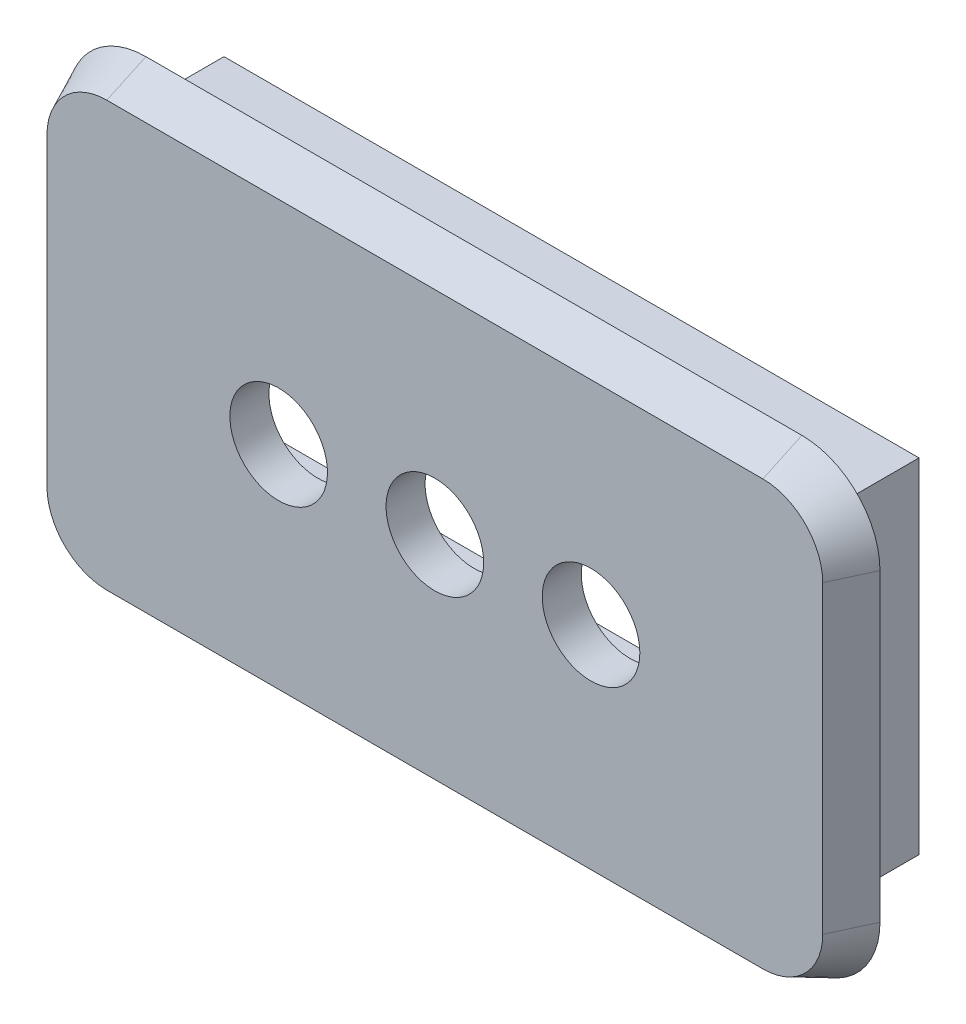
ISO-10303-21;
HEADER;
FILE_DESCRIPTION(('STEP AP214'),'2;1');
FILE_NAME('part.step','',(''),(''),'','','');
FILE_SCHEMA(('AUTOMOTIVE_DESIGN { 1 0 10303 214 1 1 1 1 }'));
ENDSEC;
DATA;
#1=APPLICATION_CONTEXT('core data for automotive mechanical design processes');
#2=APPLICATION_PROTOCOL_DEFINITION('international standard','automotive_design',2000,#1);
#3=PRODUCT_CONTEXT('',#1,'mechanical');
#4=PRODUCT('Part','Part','',(#3));
#5=PRODUCT_RELATED_PRODUCT_CATEGORY('part','',(#4));
#6=PRODUCT_DEFINITION_FORMATION('','',#4);
#7=PRODUCT_DEFINITION_CONTEXT('part definition',#1,'design');
#8=PRODUCT_DEFINITION('design','',#6,#7);
#9=PRODUCT_DEFINITION_SHAPE('','',#8);
#10=(LENGTH_UNIT() NAMED_UNIT(*) SI_UNIT(.MILLI.,.METRE.));
#11=(NAMED_UNIT(*) PLANE_ANGLE_UNIT() SI_UNIT($,.RADIAN.));
#12=(NAMED_UNIT(*) SI_UNIT($,.STERADIAN.) SOLID_ANGLE_UNIT());
#13=UNCERTAINTY_MEASURE_WITH_UNIT(LENGTH_MEASURE(1.E-05),#10,'distance_accuracy_value','');
#14=(GEOMETRIC_REPRESENTATION_CONTEXT(3) GLOBAL_UNCERTAINTY_ASSIGNED_CONTEXT((#13)) GLOBAL_UNIT_ASSIGNED_CONTEXT((#10,
#11,#12)) REPRESENTATION_CONTEXT('',''));
#15=CARTESIAN_POINT('',(0.,0.,0.));
#16=DIRECTION('',(0.,0.,1.));
#17=DIRECTION('',(1.,0.,0.));
#18=AXIS2_PLACEMENT_3D('',#15,#16,#17);
#19=CARTESIAN_POINT('',(9.33499999999989,29.9,-2.5));
#20=DIRECTION('',(0.,1.,0.));
#21=DIRECTION('',(0.,0.,1.));
#22=AXIS2_PLACEMENT_3D('',#19,#20,#21);
#23=PLANE('',#22);
#24=DIRECTION('',(-1.,0.,0.));
#25=VECTOR('',#24,1.);
#26=CARTESIAN_POINT('',(9.33499999999989,29.9,0.));
#27=LINE('',#26,#25);
#28=CARTESIAN_POINT('',(9.33499999999989,29.9,0.));
#29=VERTEX_POINT('',#28);
#30=CARTESIAN_POINT('',(-8.46500000000011,29.9,0.));
#31=VERTEX_POINT('',#30);
#32=EDGE_CURVE('E265',#29,#31,#27,.T.);
#33=ORIENTED_EDGE('',*,*,#32,.F.);
#34=DIRECTION('',(0.,0.,1.));
#35=VECTOR('',#34,1.);
#36=CARTESIAN_POINT('',(9.33499999999989,29.9,-2.5));
#37=LINE('',#36,#35);
#38=CARTESIAN_POINT('',(9.33499999999989,29.9,-2.5));
#39=VERTEX_POINT('',#38);
#40=EDGE_CURVE('E11',#39,#29,#37,.T.);
#41=ORIENTED_EDGE('',*,*,#40,.F.);
#42=DIRECTION('',(-1.,0.,0.));
#43=VECTOR('',#42,1.);
#44=CARTESIAN_POINT('',(9.33499999999989,29.9,-2.5));
#45=LINE('',#44,#43);
#46=CARTESIAN_POINT('',(-8.46500000000011,29.9,-2.5));
#47=VERTEX_POINT('',#46);
#48=EDGE_CURVE('E273',#39,#47,#45,.T.);
#49=ORIENTED_EDGE('',*,*,#48,.T.);
#50=DIRECTION('',(0.,0.,1.));
#51=VECTOR('',#50,1.);
#52=CARTESIAN_POINT('',(-8.46500000000011,29.9,-2.5));
#53=LINE('',#52,#51);
#54=EDGE_CURVE('E44',#47,#31,#53,.T.);
#55=ORIENTED_EDGE('',*,*,#54,.T.);
#56=EDGE_LOOP('',(#33,#41,#49,#55));
#57=FACE_BOUND('',#56,.T.);
#58=ADVANCED_FACE('F41',(#57),#23,.T.);
#59=CARTESIAN_POINT('',(9.33499999999988,21.1,-2.5));
#60=DIRECTION('',(1.,0.,0.));
#61=DIRECTION('',(0.,1.,0.));
#62=AXIS2_PLACEMENT_3D('',#59,#60,#61);
#63=PLANE('',#62);
#64=DIRECTION('',(0.,1.,0.));
#65=VECTOR('',#64,1.);
#66=CARTESIAN_POINT('',(9.33499999999988,21.1,0.));
#67=LINE('',#66,#65);
#68=CARTESIAN_POINT('',(9.33499999999988,21.1,0.));
#69=VERTEX_POINT('',#68);
#70=EDGE_CURVE('E276',#69,#29,#67,.T.);
#71=ORIENTED_EDGE('',*,*,#70,.F.);
#72=DIRECTION('',(0.,0.,1.));
#73=VECTOR('',#72,1.);
#74=CARTESIAN_POINT('',(9.33499999999988,21.1,-2.5));
#75=LINE('',#74,#73);
#76=CARTESIAN_POINT('',(9.33499999999988,21.1,-2.5));
#77=VERTEX_POINT('',#76);
#78=EDGE_CURVE('E49',#77,#69,#75,.T.);
#79=ORIENTED_EDGE('',*,*,#78,.F.);
#80=DIRECTION('',(0.,1.,0.));
#81=VECTOR('',#80,1.);
#82=CARTESIAN_POINT('',(9.33499999999988,21.1,-2.5));
#83=LINE('',#82,#81);
#84=EDGE_CURVE('E280',#77,#39,#83,.T.);
#85=ORIENTED_EDGE('',*,*,#84,.T.);
#86=ORIENTED_EDGE('',*,*,#40,.T.);
#87=EDGE_LOOP('',(#71,#79,#85,#86));
#88=FACE_BOUND('',#87,.T.);
#89=ADVANCED_FACE('F296',(#88),#63,.T.);
#90=CARTESIAN_POINT('',(-8.46500000000011,21.1,-2.5));
#91=DIRECTION('',(0.,-1.,0.));
#92=DIRECTION('',(0.,0.,-1.));
#93=AXIS2_PLACEMENT_3D('',#90,#91,#92);
#94=PLANE('',#93);
#95=DIRECTION('',(1.,0.,0.));
#96=VECTOR('',#95,1.);
#97=CARTESIAN_POINT('',(-8.46500000000011,21.1,0.));
#98=LINE('',#97,#96);
#99=CARTESIAN_POINT('',(-8.46500000000011,21.1,0.));
#100=VERTEX_POINT('',#99);
#101=EDGE_CURVE('E288',#100,#69,#98,.T.);
#102=ORIENTED_EDGE('',*,*,#101,.F.);
#103=DIRECTION('',(0.,0.,1.));
#104=VECTOR('',#103,1.);
#105=CARTESIAN_POINT('',(-8.46500000000011,21.1,-2.5));
#106=LINE('',#105,#104);
#107=CARTESIAN_POINT('',(-8.46500000000011,21.1,-2.5));
#108=VERTEX_POINT('',#107);
#109=EDGE_CURVE('E293',#108,#100,#106,.T.);
#110=ORIENTED_EDGE('',*,*,#109,.F.);
#111=DIRECTION('',(1.,0.,0.));
#112=VECTOR('',#111,1.);
#113=CARTESIAN_POINT('',(-8.46500000000011,21.1,-2.5));
#114=LINE('',#113,#112);
#115=EDGE_CURVE('E278',#108,#77,#114,.T.);
#116=ORIENTED_EDGE('',*,*,#115,.T.);
#117=ORIENTED_EDGE('',*,*,#78,.T.);
#118=EDGE_LOOP('',(#102,#110,#116,#117));
#119=FACE_BOUND('',#118,.T.);
#120=ADVANCED_FACE('F301',(#119),#94,.T.);
#121=CARTESIAN_POINT('',(-8.46500000000011,29.9,-2.5));
#122=DIRECTION('',(-1.,0.,0.));
#123=DIRECTION('',(0.,-1.,0.));
#124=AXIS2_PLACEMENT_3D('',#121,#122,#123);
#125=PLANE('',#124);
#126=DIRECTION('',(0.,-1.,0.));
#127=VECTOR('',#126,1.);
#128=CARTESIAN_POINT('',(-8.46500000000011,29.9,0.));
#129=LINE('',#128,#127);
#130=EDGE_CURVE('E285',#31,#100,#129,.T.);
#131=ORIENTED_EDGE('',*,*,#130,.F.);
#132=ORIENTED_EDGE('',*,*,#54,.F.);
#133=DIRECTION('',(0.,-1.,0.));
#134=VECTOR('',#133,1.);
#135=CARTESIAN_POINT('',(-8.46500000000011,29.9,-2.5));
#136=LINE('',#135,#134);
#137=EDGE_CURVE('E275',#47,#108,#136,.T.);
#138=ORIENTED_EDGE('',*,*,#137,.T.);
#139=ORIENTED_EDGE('',*,*,#109,.T.);
#140=EDGE_LOOP('',(#131,#132,#138,#139));
#141=FACE_BOUND('',#140,.T.);
#142=ADVANCED_FACE('F294',(#141),#125,.T.);
#143=CARTESIAN_POINT('',(0.,0.,-2.5));
#144=DIRECTION('',(0.,0.,1.));
#145=DIRECTION('',(1.,0.,0.));
#146=AXIS2_PLACEMENT_3D('',#143,#144,#145);
#147=PLANE('',#146);
#148=DIRECTION('',(0.,1.,0.));
#149=VECTOR('',#148,1.);
#150=CARTESIAN_POINT('',(8.33499999999988,22.1,-2.5));
#151=LINE('',#150,#149);
#152=CARTESIAN_POINT('',(8.33499999999988,22.1,-2.5));
#153=VERTEX_POINT('',#152);
#154=CARTESIAN_POINT('',(8.33499999999988,28.9,-2.5));
#155=VERTEX_POINT('',#154);
#156=EDGE_CURVE('E248',#153,#155,#151,.T.);
#157=ORIENTED_EDGE('',*,*,#156,.T.);
#158=DIRECTION('',(-1.,0.,0.));
#159=VECTOR('',#158,1.);
#160=CARTESIAN_POINT('',(8.33499999999988,28.9,-2.5));
#161=LINE('',#160,#159);
#162=CARTESIAN_POINT('',(-7.46500000000011,28.9,-2.5));
#163=VERTEX_POINT('',#162);
#164=EDGE_CURVE('E240',#155,#163,#161,.T.);
#165=ORIENTED_EDGE('',*,*,#164,.T.);
#166=DIRECTION('',(0.,-1.,0.));
#167=VECTOR('',#166,1.);
#168=CARTESIAN_POINT('',(-7.46500000000011,28.9,-2.5));
#169=LINE('',#168,#167);
#170=CARTESIAN_POINT('',(-7.46500000000011,22.1,-2.5));
#171=VERTEX_POINT('',#170);
#172=EDGE_CURVE('E243',#163,#171,#169,.T.);
#173=ORIENTED_EDGE('',*,*,#172,.T.);
#174=DIRECTION('',(1.,0.,0.));
#175=VECTOR('',#174,1.);
#176=CARTESIAN_POINT('',(-7.46500000000011,22.1,-2.5));
#177=LINE('',#176,#175);
#178=EDGE_CURVE('E57',#171,#153,#177,.T.);
#179=ORIENTED_EDGE('',*,*,#178,.T.);
#180=EDGE_LOOP('',(#157,#165,#173,#179));
#181=FACE_BOUND('',#180,.T.);
#182=ORIENTED_EDGE('',*,*,#48,.F.);
#183=ORIENTED_EDGE('',*,*,#84,.F.);
#184=ORIENTED_EDGE('',*,*,#115,.F.);
#185=ORIENTED_EDGE('',*,*,#137,.F.);
#186=EDGE_LOOP('',(#182,#183,#184,#185));
#187=FACE_BOUND('',#186,.T.);
#188=ADVANCED_FACE('F300',(#181,#187),#147,.F.);
#189=CARTESIAN_POINT('',(8.33499999999988,28.9,-2.5));
#190=DIRECTION('',(0.,1.,0.));
#191=DIRECTION('',(-1.,0.,0.));
#192=AXIS2_PLACEMENT_3D('',#189,#190,#191);
#193=PLANE('',#192);
#194=DIRECTION('',(-1.,0.,0.));
#195=VECTOR('',#194,1.);
#196=CARTESIAN_POINT('',(8.33499999999988,28.9,0.));
#197=LINE('',#196,#195);
#198=CARTESIAN_POINT('',(8.33499999999988,28.9,0.));
#199=VERTEX_POINT('',#198);
#200=CARTESIAN_POINT('',(-7.46500000000011,28.9,0.));
#201=VERTEX_POINT('',#200);
#202=EDGE_CURVE('E183',#199,#201,#197,.T.);
#203=ORIENTED_EDGE('',*,*,#202,.T.);
#204=DIRECTION('',(0.,0.,1.));
#205=VECTOR('',#204,1.);
#206=CARTESIAN_POINT('',(-7.46500000000011,28.9,-2.5));
#207=LINE('',#206,#205);
#208=EDGE_CURVE('E251',#163,#201,#207,.T.);
#209=ORIENTED_EDGE('',*,*,#208,.F.);
#210=ORIENTED_EDGE('',*,*,#164,.F.);
#211=DIRECTION('',(0.,0.,1.));
#212=VECTOR('',#211,1.);
#213=CARTESIAN_POINT('',(8.33499999999988,28.9,-2.5));
#214=LINE('',#213,#212);
#215=EDGE_CURVE('E262',#155,#199,#214,.T.);
#216=ORIENTED_EDGE('',*,*,#215,.T.);
#217=EDGE_LOOP('',(#203,#209,#210,#216));
#218=FACE_BOUND('',#217,.T.);
#219=ADVANCED_FACE('F339',(#218),#193,.F.);
#220=CARTESIAN_POINT('',(8.33499999999988,22.1,-2.5));
#221=DIRECTION('',(1.,0.,0.));
#222=DIRECTION('',(0.,1.,0.));
#223=AXIS2_PLACEMENT_3D('',#220,#221,#222);
#224=PLANE('',#223);
#225=DIRECTION('',(0.,1.,0.));
#226=VECTOR('',#225,1.);
#227=CARTESIAN_POINT('',(8.33499999999988,22.1,0.));
#228=LINE('',#227,#226);
#229=CARTESIAN_POINT('',(8.33499999999988,22.1,0.));
#230=VERTEX_POINT('',#229);
#231=EDGE_CURVE('E244',#230,#199,#228,.T.);
#232=ORIENTED_EDGE('',*,*,#231,.T.);
#233=ORIENTED_EDGE('',*,*,#215,.F.);
#234=ORIENTED_EDGE('',*,*,#156,.F.);
#235=DIRECTION('',(0.,0.,1.));
#236=VECTOR('',#235,1.);
#237=CARTESIAN_POINT('',(8.33499999999988,22.1,-2.5));
#238=LINE('',#237,#236);
#239=EDGE_CURVE('E266',#153,#230,#238,.T.);
#240=ORIENTED_EDGE('',*,*,#239,.T.);
#241=EDGE_LOOP('',(#232,#233,#234,#240));
#242=FACE_BOUND('',#241,.T.);
#243=ADVANCED_FACE('F347',(#242),#224,.F.);
#244=CARTESIAN_POINT('',(-7.46500000000011,22.1,-2.5));
#245=DIRECTION('',(0.,-1.,0.));
#246=DIRECTION('',(0.,0.,-1.));
#247=AXIS2_PLACEMENT_3D('',#244,#245,#246);
#248=PLANE('',#247);
#249=DIRECTION('',(1.,0.,0.));
#250=VECTOR('',#249,1.);
#251=CARTESIAN_POINT('',(-7.46500000000011,22.1,0.));
#252=LINE('',#251,#250);
#253=CARTESIAN_POINT('',(-7.46500000000011,22.1,0.));
#254=VERTEX_POINT('',#253);
#255=EDGE_CURVE('E257',#254,#230,#252,.T.);
#256=ORIENTED_EDGE('',*,*,#255,.T.);
#257=ORIENTED_EDGE('',*,*,#239,.F.);
#258=ORIENTED_EDGE('',*,*,#178,.F.);
#259=DIRECTION('',(0.,0.,1.));
#260=VECTOR('',#259,1.);
#261=CARTESIAN_POINT('',(-7.46500000000011,22.1,-2.5));
#262=LINE('',#261,#260);
#263=EDGE_CURVE('E269',#171,#254,#262,.T.);
#264=ORIENTED_EDGE('',*,*,#263,.T.);
#265=EDGE_LOOP('',(#256,#257,#258,#264));
#266=FACE_BOUND('',#265,.T.);
#267=ADVANCED_FACE('F357',(#266),#248,.F.);
#268=CARTESIAN_POINT('',(-7.46500000000011,28.9,-2.5));
#269=DIRECTION('',(-1.,0.,0.));
#270=DIRECTION('',(0.,0.,1.));
#271=AXIS2_PLACEMENT_3D('',#268,#269,#270);
#272=PLANE('',#271);
#273=DIRECTION('',(0.,-1.,0.));
#274=VECTOR('',#273,1.);
#275=CARTESIAN_POINT('',(-7.46500000000011,28.9,0.));
#276=LINE('',#275,#274);
#277=EDGE_CURVE('E254',#201,#254,#276,.T.);
#278=ORIENTED_EDGE('',*,*,#277,.T.);
#279=ORIENTED_EDGE('',*,*,#263,.F.);
#280=ORIENTED_EDGE('',*,*,#172,.F.);
#281=ORIENTED_EDGE('',*,*,#208,.T.);
#282=EDGE_LOOP('',(#278,#279,#280,#281));
#283=FACE_BOUND('',#282,.T.);
#284=ADVANCED_FACE('F367',(#283),#272,.F.);
#285=CARTESIAN_POINT('',(8.83499999999989,29.4,1.));
#286=DIRECTION('',(0.,0.,1.));
#287=DIRECTION('',(1.,0.,0.));
#288=AXIS2_PLACEMENT_3D('',#285,#286,#287);
#289=PLANE('',#288);
#290=CARTESIAN_POINT('',(4.43499999999989,25.5,1.));
#291=DIRECTION('',(0.,0.,1.));
#292=DIRECTION('',(1.,0.,0.));
#293=AXIS2_PLACEMENT_3D('',#290,#291,#292);
#294=CIRCLE('',#293,1.25);
#295=CARTESIAN_POINT('',(5.68499999999989,25.5,1.));
#296=VERTEX_POINT('',#295);
#297=EDGE_CURVE('E515',#296,#296,#294,.T.);
#298=ORIENTED_EDGE('',*,*,#297,.F.);
#299=EDGE_LOOP('',(#298));
#300=FACE_BOUND('',#299,.T.);
#301=CARTESIAN_POINT('',(-3.56500000000011,25.5,1.));
#302=DIRECTION('',(0.,0.,1.));
#303=DIRECTION('',(1.,0.,0.));
#304=AXIS2_PLACEMENT_3D('',#301,#302,#303);
#305=CIRCLE('',#304,1.25);
#306=CARTESIAN_POINT('',(-2.31500000000011,25.5,1.));
#307=VERTEX_POINT('',#306);
#308=EDGE_CURVE('E523',#307,#307,#305,.T.);
#309=ORIENTED_EDGE('',*,*,#308,.F.);
#310=EDGE_LOOP('',(#309));
#311=FACE_BOUND('',#310,.T.);
#312=CARTESIAN_POINT('',(0.434999999999888,25.5,1.));
#313=DIRECTION('',(0.,0.,1.));
#314=DIRECTION('',(1.,0.,0.));
#315=AXIS2_PLACEMENT_3D('',#312,#313,#314);
#316=CIRCLE('',#315,1.25);
#317=CARTESIAN_POINT('',(1.68499999999989,25.5,1.));
#318=VERTEX_POINT('',#317);
#319=EDGE_CURVE('E193',#318,#318,#316,.T.);
#320=ORIENTED_EDGE('',*,*,#319,.F.);
#321=EDGE_LOOP('',(#320));
#322=FACE_BOUND('',#321,.T.);
#323=CARTESIAN_POINT('',(8.83499999999989,29.4,1.));
#324=DIRECTION('',(0.,0.,1.));
#325=DIRECTION('',(1.,0.,0.));
#326=AXIS2_PLACEMENT_3D('',#323,#324,#325);
#327=CIRCLE('',#326,1.533692341845);
#328=CARTESIAN_POINT('',(10.3686923418449,29.4,1.));
#329=VERTEX_POINT('',#328);
#330=CARTESIAN_POINT('',(8.83499999999989,30.933692341845,1.));
#331=VERTEX_POINT('',#330);
#332=EDGE_CURVE('E207',#329,#331,#327,.T.);
#333=ORIENTED_EDGE('',*,*,#332,.T.);
#334=DIRECTION('',(1.,0.,0.));
#335=VECTOR('',#334,1.);
#336=CARTESIAN_POINT('',(8.83499999999989,30.933692341845,1.));
#337=LINE('',#336,#335);
#338=CARTESIAN_POINT('',(-7.96500000000011,30.933692341845,1.));
#339=VERTEX_POINT('',#338);
#340=EDGE_CURVE('E179',#331,#339,#337,.F.);
#341=ORIENTED_EDGE('',*,*,#340,.T.);
#342=CARTESIAN_POINT('',(-7.96500000000011,29.4,1.));
#343=DIRECTION('',(0.,0.,1.));
#344=DIRECTION('',(1.,0.,0.));
#345=AXIS2_PLACEMENT_3D('',#342,#343,#344);
#346=CIRCLE('',#345,1.533692341845);
#347=CARTESIAN_POINT('',(-9.49869234184511,29.4,1.));
#348=VERTEX_POINT('',#347);
#349=EDGE_CURVE('E229',#339,#348,#346,.T.);
#350=ORIENTED_EDGE('',*,*,#349,.T.);
#351=DIRECTION('',(0.,1.,0.));
#352=VECTOR('',#351,1.);
#353=CARTESIAN_POINT('',(-9.49869234184511,29.4,1.));
#354=LINE('',#353,#352);
#355=CARTESIAN_POINT('',(-9.49869234184511,21.6,1.));
#356=VERTEX_POINT('',#355);
#357=EDGE_CURVE('E231',#348,#356,#354,.F.);
#358=ORIENTED_EDGE('',*,*,#357,.T.);
#359=CARTESIAN_POINT('',(-7.96500000000011,21.6,1.));
#360=DIRECTION('',(0.,0.,1.));
#361=DIRECTION('',(1.,0.,0.));
#362=AXIS2_PLACEMENT_3D('',#359,#360,#361);
#363=CIRCLE('',#362,1.533692341845);
#364=CARTESIAN_POINT('',(-7.96500000000009,20.066307658155,1.));
#365=VERTEX_POINT('',#364);
#366=EDGE_CURVE('E233',#356,#365,#363,.T.);
#367=ORIENTED_EDGE('',*,*,#366,.T.);
#368=DIRECTION('',(-1.,0.,0.));
#369=VECTOR('',#368,1.);
#370=CARTESIAN_POINT('',(-7.96500000000009,20.066307658155,1.));
#371=LINE('',#370,#369);
#372=CARTESIAN_POINT('',(8.83499999999987,20.066307658155,1.));
#373=VERTEX_POINT('',#372);
#374=EDGE_CURVE('E235',#365,#373,#371,.F.);
#375=ORIENTED_EDGE('',*,*,#374,.T.);
#376=CARTESIAN_POINT('',(8.83499999999988,21.6,1.));
#377=DIRECTION('',(0.,0.,1.));
#378=DIRECTION('',(1.,0.,0.));
#379=AXIS2_PLACEMENT_3D('',#376,#377,#378);
#380=CIRCLE('',#379,1.533692341845);
#381=CARTESIAN_POINT('',(10.3686923418449,21.6,1.));
#382=VERTEX_POINT('',#381);
#383=EDGE_CURVE('E237',#373,#382,#380,.T.);
#384=ORIENTED_EDGE('',*,*,#383,.T.);
#385=DIRECTION('',(0.,-1.,0.));
#386=VECTOR('',#385,1.);
#387=CARTESIAN_POINT('',(10.3686923418449,21.6,1.));
#388=LINE('',#387,#386);
#389=EDGE_CURVE('E211',#382,#329,#388,.F.);
#390=ORIENTED_EDGE('',*,*,#389,.T.);
#391=EDGE_LOOP('',(#333,#341,#350,#358,#367,#375,#384,#390));
#392=FACE_BOUND('',#391,.T.);
#393=ADVANCED_FACE('F376',(#300,#311,#322,#392),#289,.T.);
#394=CARTESIAN_POINT('',(10.8349999999999,21.6,0.));
#395=DIRECTION('',(0.90630778703665,0.,0.4226182617407));
#396=DIRECTION('',(0.4226182617407,0.,-0.90630778703665));
#397=AXIS2_PLACEMENT_3D('',#394,#395,#396);
#398=PLANE('',#397);
#399=DIRECTION('',(0.,1.,0.));
#400=VECTOR('',#399,1.);
#401=CARTESIAN_POINT('',(10.8349999999999,21.6,0.));
#402=LINE('',#401,#400);
#403=CARTESIAN_POINT('',(10.8349999999999,21.6,0.));
#404=VERTEX_POINT('',#403);
#405=CARTESIAN_POINT('',(10.8349999999999,29.4,0.));
#406=VERTEX_POINT('',#405);
#407=EDGE_CURVE('E206',#404,#406,#402,.T.);
#408=ORIENTED_EDGE('',*,*,#407,.T.);
#409=DIRECTION('',(0.4226182617407,0.,-0.90630778703665));
#410=VECTOR('',#409,1.);
#411=CARTESIAN_POINT('',(10.8349999999999,29.4,0.));
#412=LINE('',#411,#410);
#413=EDGE_CURVE('E189',#329,#406,#412,.T.);
#414=ORIENTED_EDGE('',*,*,#413,.F.);
#415=ORIENTED_EDGE('',*,*,#389,.F.);
#416=DIRECTION('',(0.4226182617407,0.,-0.90630778703665));
#417=VECTOR('',#416,1.);
#418=CARTESIAN_POINT('',(10.8349999999999,21.6,0.));
#419=LINE('',#418,#417);
#420=EDGE_CURVE('E210',#382,#404,#419,.T.);
#421=ORIENTED_EDGE('',*,*,#420,.T.);
#422=EDGE_LOOP('',(#408,#414,#415,#421));
#423=FACE_BOUND('',#422,.T.);
#424=ADVANCED_FACE('F387',(#423),#398,.T.);
#425=CARTESIAN_POINT('',(8.83499999999988,21.6,0.));
#426=DIRECTION('',(0.,0.,-1.));
#427=DIRECTION('',(-1.,0.,0.));
#428=AXIS2_PLACEMENT_3D('',#425,#426,#427);
#429=CONICAL_SURFACE('',#428,2.,0.436332312998583);
#430=CARTESIAN_POINT('',(8.83499999999988,21.6,0.));
#431=DIRECTION('',(0.,0.,1.));
#432=DIRECTION('',(-1.,0.,0.));
#433=AXIS2_PLACEMENT_3D('',#430,#431,#432);
#434=CIRCLE('',#433,2.);
#435=CARTESIAN_POINT('',(8.83499999999987,19.6,0.));
#436=VERTEX_POINT('',#435);
#437=EDGE_CURVE('E204',#436,#404,#434,.T.);
#438=ORIENTED_EDGE('',*,*,#437,.T.);
#439=ORIENTED_EDGE('',*,*,#420,.F.);
#440=ORIENTED_EDGE('',*,*,#383,.F.);
#441=DIRECTION('',(0.,-0.4226182617407,-0.90630778703665));
#442=VECTOR('',#441,1.);
#443=CARTESIAN_POINT('',(8.83499999999987,19.6,0.));
#444=LINE('',#443,#442);
#445=EDGE_CURVE('E214',#373,#436,#444,.T.);
#446=ORIENTED_EDGE('',*,*,#445,.T.);
#447=EDGE_LOOP('',(#438,#439,#440,#446));
#448=FACE_BOUND('',#447,.T.);
#449=ADVANCED_FACE('F398',(#448),#429,.T.);
#450=CARTESIAN_POINT('',(-7.96500000000009,19.6,0.));
#451=DIRECTION('',(0.,-0.90630778703665,0.4226182617407));
#452=DIRECTION('',(0.,-0.4226182617407,-0.90630778703665));
#453=AXIS2_PLACEMENT_3D('',#450,#451,#452);
#454=PLANE('',#453);
#455=DIRECTION('',(1.,0.,0.));
#456=VECTOR('',#455,1.);
#457=CARTESIAN_POINT('',(-7.96500000000009,19.6,0.));
#458=LINE('',#457,#456);
#459=CARTESIAN_POINT('',(-7.96500000000009,19.6,0.));
#460=VERTEX_POINT('',#459);
#461=EDGE_CURVE('E202',#460,#436,#458,.T.);
#462=ORIENTED_EDGE('',*,*,#461,.T.);
#463=ORIENTED_EDGE('',*,*,#445,.F.);
#464=ORIENTED_EDGE('',*,*,#374,.F.);
#465=DIRECTION('',(0.,-0.4226182617407,-0.90630778703665));
#466=VECTOR('',#465,1.);
#467=CARTESIAN_POINT('',(-7.96500000000009,19.6,0.));
#468=LINE('',#467,#466);
#469=EDGE_CURVE('E217',#365,#460,#468,.T.);
#470=ORIENTED_EDGE('',*,*,#469,.T.);
#471=EDGE_LOOP('',(#462,#463,#464,#470));
#472=FACE_BOUND('',#471,.T.);
#473=ADVANCED_FACE('F408',(#472),#454,.T.);
#474=CARTESIAN_POINT('',(-7.96500000000011,21.6,0.));
#475=DIRECTION('',(0.,0.,-1.));
#476=DIRECTION('',(-1.,0.,0.));
#477=AXIS2_PLACEMENT_3D('',#474,#475,#476);
#478=CONICAL_SURFACE('',#477,2.,0.436332312998583);
#479=CARTESIAN_POINT('',(-7.96500000000011,21.6,0.));
#480=DIRECTION('',(0.,0.,1.));
#481=DIRECTION('',(-1.,0.,0.));
#482=AXIS2_PLACEMENT_3D('',#479,#480,#481);
#483=CIRCLE('',#482,2.);
#484=CARTESIAN_POINT('',(-9.96500000000011,21.6,0.));
#485=VERTEX_POINT('',#484);
#486=EDGE_CURVE('E200',#485,#460,#483,.T.);
#487=ORIENTED_EDGE('',*,*,#486,.T.);
#488=ORIENTED_EDGE('',*,*,#469,.F.);
#489=ORIENTED_EDGE('',*,*,#366,.F.);
#490=DIRECTION('',(-0.4226182617407,0.,-0.90630778703665));
#491=VECTOR('',#490,1.);
#492=CARTESIAN_POINT('',(-9.96500000000011,21.6,0.));
#493=LINE('',#492,#491);
#494=EDGE_CURVE('E220',#356,#485,#493,.T.);
#495=ORIENTED_EDGE('',*,*,#494,.T.);
#496=EDGE_LOOP('',(#487,#488,#489,#495));
#497=FACE_BOUND('',#496,.T.);
#498=ADVANCED_FACE('F418',(#497),#478,.T.);
#499=CARTESIAN_POINT('',(-9.96500000000011,29.4,0.));
#500=DIRECTION('',(-0.90630778703665,0.,0.4226182617407));
#501=DIRECTION('',(0.4226182617407,0.,0.90630778703665));
#502=AXIS2_PLACEMENT_3D('',#499,#500,#501);
#503=PLANE('',#502);
#504=DIRECTION('',(0.,-1.,0.));
#505=VECTOR('',#504,1.);
#506=CARTESIAN_POINT('',(-9.96500000000011,29.4,0.));
#507=LINE('',#506,#505);
#508=CARTESIAN_POINT('',(-9.96500000000011,29.4,0.));
#509=VERTEX_POINT('',#508);
#510=EDGE_CURVE('E198',#509,#485,#507,.T.);
#511=ORIENTED_EDGE('',*,*,#510,.T.);
#512=ORIENTED_EDGE('',*,*,#494,.F.);
#513=ORIENTED_EDGE('',*,*,#357,.F.);
#514=DIRECTION('',(-0.4226182617407,0.,-0.90630778703665));
#515=VECTOR('',#514,1.);
#516=CARTESIAN_POINT('',(-9.96500000000011,29.4,0.));
#517=LINE('',#516,#515);
#518=EDGE_CURVE('E223',#348,#509,#517,.T.);
#519=ORIENTED_EDGE('',*,*,#518,.T.);
#520=EDGE_LOOP('',(#511,#512,#513,#519));
#521=FACE_BOUND('',#520,.T.);
#522=ADVANCED_FACE('F428',(#521),#503,.T.);
#523=CARTESIAN_POINT('',(-7.96500000000011,29.4,0.));
#524=DIRECTION('',(0.,0.,-1.));
#525=DIRECTION('',(-1.,0.,0.));
#526=AXIS2_PLACEMENT_3D('',#523,#524,#525);
#527=CONICAL_SURFACE('',#526,2.,0.436332312998583);
#528=CARTESIAN_POINT('',(-7.96500000000011,29.4,0.));
#529=DIRECTION('',(0.,0.,1.));
#530=DIRECTION('',(-1.,0.,0.));
#531=AXIS2_PLACEMENT_3D('',#528,#529,#530);
#532=CIRCLE('',#531,2.);
#533=CARTESIAN_POINT('',(-7.96500000000011,31.4,0.));
#534=VERTEX_POINT('',#533);
#535=EDGE_CURVE('E171',#534,#509,#532,.T.);
#536=ORIENTED_EDGE('',*,*,#535,.T.);
#537=ORIENTED_EDGE('',*,*,#518,.F.);
#538=ORIENTED_EDGE('',*,*,#349,.F.);
#539=DIRECTION('',(0.,0.4226182617407,-0.90630778703665));
#540=VECTOR('',#539,1.);
#541=CARTESIAN_POINT('',(-7.96500000000011,31.4,0.));
#542=LINE('',#541,#540);
#543=EDGE_CURVE('E184',#339,#534,#542,.T.);
#544=ORIENTED_EDGE('',*,*,#543,.T.);
#545=EDGE_LOOP('',(#536,#537,#538,#544));
#546=FACE_BOUND('',#545,.T.);
#547=ADVANCED_FACE('F438',(#546),#527,.T.);
#548=CARTESIAN_POINT('',(8.83499999999989,31.4,0.));
#549=DIRECTION('',(0.,0.90630778703665,0.4226182617407));
#550=DIRECTION('',(0.,-0.4226182617407,0.90630778703665));
#551=AXIS2_PLACEMENT_3D('',#548,#549,#550);
#552=PLANE('',#551);
#553=DIRECTION('',(-1.,0.,0.));
#554=VECTOR('',#553,1.);
#555=CARTESIAN_POINT('',(8.83499999999989,31.4,0.));
#556=LINE('',#555,#554);
#557=CARTESIAN_POINT('',(8.83499999999989,31.4,0.));
#558=VERTEX_POINT('',#557);
#559=EDGE_CURVE('E163',#558,#534,#556,.T.);
#560=ORIENTED_EDGE('',*,*,#559,.T.);
#561=ORIENTED_EDGE('',*,*,#543,.F.);
#562=ORIENTED_EDGE('',*,*,#340,.F.);
#563=DIRECTION('',(0.,0.4226182617407,-0.90630778703665));
#564=VECTOR('',#563,1.);
#565=CARTESIAN_POINT('',(8.83499999999989,31.4,0.));
#566=LINE('',#565,#564);
#567=EDGE_CURVE('E177',#331,#558,#566,.T.);
#568=ORIENTED_EDGE('',*,*,#567,.T.);
#569=EDGE_LOOP('',(#560,#561,#562,#568));
#570=FACE_BOUND('',#569,.T.);
#571=ADVANCED_FACE('F178',(#570),#552,.T.);
#572=CARTESIAN_POINT('',(8.83499999999989,29.4,0.));
#573=DIRECTION('',(0.,0.,-1.));
#574=DIRECTION('',(1.,0.,0.));
#575=AXIS2_PLACEMENT_3D('',#572,#573,#574);
#576=CONICAL_SURFACE('',#575,2.,0.436332312998583);
#577=CARTESIAN_POINT('',(8.83499999999989,29.4,0.));
#578=DIRECTION('',(0.,0.,1.));
#579=DIRECTION('',(1.,0.,0.));
#580=AXIS2_PLACEMENT_3D('',#577,#578,#579);
#581=CIRCLE('',#580,2.);
#582=EDGE_CURVE('E169',#406,#558,#581,.T.);
#583=ORIENTED_EDGE('',*,*,#582,.T.);
#584=ORIENTED_EDGE('',*,*,#567,.F.);
#585=ORIENTED_EDGE('',*,*,#332,.F.);
#586=ORIENTED_EDGE('',*,*,#413,.T.);
#587=EDGE_LOOP('',(#583,#584,#585,#586));
#588=FACE_BOUND('',#587,.T.);
#589=ADVANCED_FACE('F187',(#588),#576,.T.);
#590=CARTESIAN_POINT('',(8.83499999999989,29.4,0.));
#591=DIRECTION('',(0.,0.,1.));
#592=DIRECTION('',(1.,0.,0.));
#593=AXIS2_PLACEMENT_3D('',#590,#591,#592);
#594=PLANE('',#593);
#595=ORIENTED_EDGE('',*,*,#582,.F.);
#596=ORIENTED_EDGE('',*,*,#407,.F.);
#597=ORIENTED_EDGE('',*,*,#437,.F.);
#598=ORIENTED_EDGE('',*,*,#461,.F.);
#599=ORIENTED_EDGE('',*,*,#486,.F.);
#600=ORIENTED_EDGE('',*,*,#510,.F.);
#601=ORIENTED_EDGE('',*,*,#535,.F.);
#602=ORIENTED_EDGE('',*,*,#559,.F.);
#603=EDGE_LOOP('',(#595,#596,#597,#598,#599,#600,#601,#602));
#604=FACE_BOUND('',#603,.T.);
#605=ORIENTED_EDGE('',*,*,#70,.T.);
#606=ORIENTED_EDGE('',*,*,#32,.T.);
#607=ORIENTED_EDGE('',*,*,#130,.T.);
#608=ORIENTED_EDGE('',*,*,#101,.T.);
#609=EDGE_LOOP('',(#605,#606,#607,#608));
#610=FACE_BOUND('',#609,.T.);
#611=ADVANCED_FACE('F165',(#604,#610),#594,.F.);
#612=CARTESIAN_POINT('',(4.43499999999989,25.5,0.));
#613=DIRECTION('',(0.,0.,1.));
#614=DIRECTION('',(1.,0.,0.));
#615=AXIS2_PLACEMENT_3D('',#612,#613,#614);
#616=CIRCLE('',#615,1.25);
#617=CARTESIAN_POINT('',(5.68499999999989,25.5,0.));
#618=VERTEX_POINT('',#617);
#619=EDGE_CURVE('E518',#618,#618,#616,.F.);
#620=ORIENTED_EDGE('',*,*,#619,.F.);
#621=EDGE_LOOP('',(#620));
#622=FACE_BOUND('',#621,.T.);
#623=CARTESIAN_POINT('',(-3.56500000000011,25.5,0.));
#624=DIRECTION('',(0.,0.,1.));
#625=DIRECTION('',(1.,0.,0.));
#626=AXIS2_PLACEMENT_3D('',#623,#624,#625);
#627=CIRCLE('',#626,1.25);
#628=CARTESIAN_POINT('',(-2.31500000000011,25.5,0.));
#629=VERTEX_POINT('',#628);
#630=EDGE_CURVE('E520',#629,#629,#627,.F.);
#631=ORIENTED_EDGE('',*,*,#630,.F.);
#632=EDGE_LOOP('',(#631));
#633=FACE_BOUND('',#632,.T.);
#634=CARTESIAN_POINT('',(0.434999999999888,25.5,0.));
#635=DIRECTION('',(0.,0.,1.));
#636=DIRECTION('',(1.,0.,0.));
#637=AXIS2_PLACEMENT_3D('',#634,#635,#636);
#638=CIRCLE('',#637,1.25);
#639=CARTESIAN_POINT('',(1.68499999999989,25.5,0.));
#640=VERTEX_POINT('',#639);
#641=EDGE_CURVE('E190',#640,#640,#638,.F.);
#642=ORIENTED_EDGE('',*,*,#641,.F.);
#643=EDGE_LOOP('',(#642));
#644=FACE_BOUND('',#643,.T.);
#645=ORIENTED_EDGE('',*,*,#202,.F.);
#646=ORIENTED_EDGE('',*,*,#231,.F.);
#647=ORIENTED_EDGE('',*,*,#255,.F.);
#648=ORIENTED_EDGE('',*,*,#277,.F.);
#649=EDGE_LOOP('',(#645,#646,#647,#648));
#650=FACE_BOUND('',#649,.T.);
#651=ADVANCED_FACE('F472',(#622,#633,#644,#650),#594,.F.);
#652=CARTESIAN_POINT('',(0.434999999999888,25.5,-2.501));
#653=DIRECTION('',(0.,0.,1.));
#654=DIRECTION('',(1.,0.,0.));
#655=AXIS2_PLACEMENT_3D('',#652,#653,#654);
#656=CYLINDRICAL_SURFACE('',#655,1.25);
#657=CARTESIAN_POINT('',(1.68499999999989,25.5,1.));
#658=CARTESIAN_POINT('',(1.68499999999989,25.5,0.989583333333333));
#659=CARTESIAN_POINT('',(1.68499999999989,25.5,0.979166666666667));
#660=CARTESIAN_POINT('',(1.68499999999989,25.5,0.958333333333333));
#661=CARTESIAN_POINT('',(1.68499999999989,25.5,0.947916666666667));
#662=CARTESIAN_POINT('',(1.68499999999989,25.5,0.927083333333333));
#663=CARTESIAN_POINT('',(1.68499999999989,25.5,0.916666666666667));
#664=CARTESIAN_POINT('',(1.68499999999989,25.5,0.895833333333333));
#665=CARTESIAN_POINT('',(1.68499999999989,25.5,0.885416666666667));
#666=CARTESIAN_POINT('',(1.68499999999989,25.5,0.864583333333333));
#667=CARTESIAN_POINT('',(1.68499999999989,25.5,0.854166666666667));
#668=CARTESIAN_POINT('',(1.68499999999989,25.5,0.833333333333333));
#669=CARTESIAN_POINT('',(1.68499999999989,25.5,0.822916666666667));
#670=CARTESIAN_POINT('',(1.68499999999989,25.5,0.802083333333333));
#671=CARTESIAN_POINT('',(1.68499999999989,25.5,0.791666666666667));
#672=CARTESIAN_POINT('',(1.68499999999989,25.5,0.770833333333333));
#673=CARTESIAN_POINT('',(1.68499999999989,25.5,0.760416666666667));
#674=CARTESIAN_POINT('',(1.68499999999989,25.5,0.739583333333333));
#675=CARTESIAN_POINT('',(1.68499999999989,25.5,0.729166666666667));
#676=CARTESIAN_POINT('',(1.68499999999989,25.5,0.708333333333333));
#677=CARTESIAN_POINT('',(1.68499999999989,25.5,0.697916666666667));
#678=CARTESIAN_POINT('',(1.68499999999989,25.5,0.677083333333333));
#679=CARTESIAN_POINT('',(1.68499999999989,25.5,0.666666666666667));
#680=CARTESIAN_POINT('',(1.68499999999989,25.5,0.645833333333333));
#681=CARTESIAN_POINT('',(1.68499999999989,25.5,0.635416666666667));
#682=CARTESIAN_POINT('',(1.68499999999989,25.5,0.614583333333333));
#683=CARTESIAN_POINT('',(1.68499999999989,25.5,0.604166666666667));
#684=CARTESIAN_POINT('',(1.68499999999989,25.5,0.583333333333333));
#685=CARTESIAN_POINT('',(1.68499999999989,25.5,0.572916666666667));
#686=CARTESIAN_POINT('',(1.68499999999989,25.5,0.552083333333333));
#687=CARTESIAN_POINT('',(1.68499999999989,25.5,0.541666666666667));
#688=CARTESIAN_POINT('',(1.68499999999989,25.5,0.520833333333333));
#689=CARTESIAN_POINT('',(1.68499999999989,25.5,0.510416666666667));
#690=CARTESIAN_POINT('',(1.68499999999989,25.5,0.489583333333333));
#691=CARTESIAN_POINT('',(1.68499999999989,25.5,0.479166666666667));
#692=CARTESIAN_POINT('',(1.68499999999989,25.5,0.458333333333333));
#693=CARTESIAN_POINT('',(1.68499999999989,25.5,0.447916666666667));
#694=CARTESIAN_POINT('',(1.68499999999989,25.5,0.427083333333333));
#695=CARTESIAN_POINT('',(1.68499999999989,25.5,0.416666666666667));
#696=CARTESIAN_POINT('',(1.68499999999989,25.5,0.395833333333333));
#697=CARTESIAN_POINT('',(1.68499999999989,25.5,0.385416666666667));
#698=CARTESIAN_POINT('',(1.68499999999989,25.5,0.364583333333333));
#699=CARTESIAN_POINT('',(1.68499999999989,25.5,0.354166666666667));
#700=CARTESIAN_POINT('',(1.68499999999989,25.5,0.333333333333333));
#701=CARTESIAN_POINT('',(1.68499999999989,25.5,0.322916666666667));
#702=CARTESIAN_POINT('',(1.68499999999989,25.5,0.302083333333334));
#703=CARTESIAN_POINT('',(1.68499999999989,25.5,0.291666666666667));
#704=CARTESIAN_POINT('',(1.68499999999989,25.5,0.270833333333334));
#705=CARTESIAN_POINT('',(1.68499999999989,25.5,0.260416666666667));
#706=CARTESIAN_POINT('',(1.68499999999989,25.5,0.239583333333334));
#707=CARTESIAN_POINT('',(1.68499999999989,25.5,0.229166666666667));
#708=CARTESIAN_POINT('',(1.68499999999989,25.5,0.208333333333334));
#709=CARTESIAN_POINT('',(1.68499999999989,25.5,0.197916666666667));
#710=CARTESIAN_POINT('',(1.68499999999989,25.5,0.177083333333333));
#711=CARTESIAN_POINT('',(1.68499999999989,25.5,0.166666666666667));
#712=CARTESIAN_POINT('',(1.68499999999989,25.5,0.145833333333333));
#713=CARTESIAN_POINT('',(1.68499999999989,25.5,0.135416666666667));
#714=CARTESIAN_POINT('',(1.68499999999989,25.5,0.114583333333333));
#715=CARTESIAN_POINT('',(1.68499999999989,25.5,0.104166666666667));
#716=CARTESIAN_POINT('',(1.68499999999989,25.5,0.0833333333333334));
#717=CARTESIAN_POINT('',(1.68499999999989,25.5,0.0729166666666667));
#718=CARTESIAN_POINT('',(1.68499999999989,25.5,0.0520833333333334));
#719=CARTESIAN_POINT('',(1.68499999999989,25.5,0.0416666666666667));
#720=CARTESIAN_POINT('',(1.68499999999989,25.5,0.0208333333333333));
#721=CARTESIAN_POINT('',(1.68499999999989,25.5,0.0104166666666667));
#722=CARTESIAN_POINT('',(1.68499999999989,25.5,0.));
#723=B_SPLINE_CURVE_WITH_KNOTS('',3,(#657,#658,#659,#660,#661,#662,#663,#664,#665,#666,#667,
#668,#669,#670,#671,#672,#673,#674,#675,#676,#677,#678,#679,#680,#681,#682,#683,#684,#685,#686,
#687,#688,#689,#690,#691,#692,#693,#694,#695,#696,#697,#698,#699,#700,#701,#702,#703,#704,#705,
#706,#707,#708,#709,#710,#711,#712,#713,#714,#715,#716,#717,#718,#719,#720,#721,#722),
.UNSPECIFIED.,.F.,.F.,(4,2,2,2,2,2,2,2,2,2,2,2,2,2,2,2,2,2,2,2,2,2,2,2,2,2,2,2,2,2,2,2,4),(0.,
0.03125,0.0625000000000001,0.0937500000000001,0.125,0.15625,0.1875,0.21875,0.25,0.28125,0.3125,
0.34375,0.375,0.40625,0.4375,0.46875,0.5,0.53125,0.5625,0.59375,0.625,0.65625,0.6875,0.71875,
0.75,0.78125,0.8125,0.84375,0.875,0.90625,0.9375,0.96875,1.),.UNSPECIFIED.);
#724=EDGE_CURVE('BSEAM480',#318,#640,#723,.T.);
#725=ORIENTED_EDGE('',*,*,#319,.T.);
#726=ORIENTED_EDGE('',*,*,#641,.T.);
#727=ORIENTED_EDGE('',*,*,#724,.T.);
#728=ORIENTED_EDGE('',*,*,#724,.F.);
#729=EDGE_LOOP('',(#725,#727,#726,#728));
#730=FACE_BOUND('',#729,.T.);
#731=ADVANCED_FACE('F480',(#730),#656,.F.);
#732=CARTESIAN_POINT('',(-3.56500000000011,25.5,-2.501));
#733=DIRECTION('',(0.,0.,1.));
#734=DIRECTION('',(1.,0.,0.));
#735=AXIS2_PLACEMENT_3D('',#732,#733,#734);
#736=CYLINDRICAL_SURFACE('',#735,1.25);
#737=CARTESIAN_POINT('',(-2.31500000000011,25.5,1.));
#738=CARTESIAN_POINT('',(-2.31500000000011,25.5,0.989583333333333));
#739=CARTESIAN_POINT('',(-2.31500000000011,25.5,0.979166666666667));
#740=CARTESIAN_POINT('',(-2.31500000000011,25.5,0.958333333333333));
#741=CARTESIAN_POINT('',(-2.31500000000011,25.5,0.947916666666667));
#742=CARTESIAN_POINT('',(-2.31500000000011,25.5,0.927083333333333));
#743=CARTESIAN_POINT('',(-2.31500000000011,25.5,0.916666666666667));
#744=CARTESIAN_POINT('',(-2.31500000000011,25.5,0.895833333333333));
#745=CARTESIAN_POINT('',(-2.31500000000011,25.5,0.885416666666667));
#746=CARTESIAN_POINT('',(-2.31500000000011,25.5,0.864583333333333));
#747=CARTESIAN_POINT('',(-2.31500000000011,25.5,0.854166666666667));
#748=CARTESIAN_POINT('',(-2.31500000000011,25.5,0.833333333333333));
#749=CARTESIAN_POINT('',(-2.31500000000011,25.5,0.822916666666667));
#750=CARTESIAN_POINT('',(-2.31500000000011,25.5,0.802083333333333));
#751=CARTESIAN_POINT('',(-2.31500000000011,25.5,0.791666666666667));
#752=CARTESIAN_POINT('',(-2.31500000000011,25.5,0.770833333333333));
#753=CARTESIAN_POINT('',(-2.31500000000011,25.5,0.760416666666667));
#754=CARTESIAN_POINT('',(-2.31500000000011,25.5,0.739583333333333));
#755=CARTESIAN_POINT('',(-2.31500000000011,25.5,0.729166666666667));
#756=CARTESIAN_POINT('',(-2.31500000000011,25.5,0.708333333333333));
#757=CARTESIAN_POINT('',(-2.31500000000011,25.5,0.697916666666667));
#758=CARTESIAN_POINT('',(-2.31500000000011,25.5,0.677083333333333));
#759=CARTESIAN_POINT('',(-2.31500000000011,25.5,0.666666666666667));
#760=CARTESIAN_POINT('',(-2.31500000000011,25.5,0.645833333333333));
#761=CARTESIAN_POINT('',(-2.31500000000011,25.5,0.635416666666667));
#762=CARTESIAN_POINT('',(-2.31500000000011,25.5,0.614583333333333));
#763=CARTESIAN_POINT('',(-2.31500000000011,25.5,0.604166666666667));
#764=CARTESIAN_POINT('',(-2.31500000000011,25.5,0.583333333333333));
#765=CARTESIAN_POINT('',(-2.31500000000011,25.5,0.572916666666667));
#766=CARTESIAN_POINT('',(-2.31500000000011,25.5,0.552083333333333));
#767=CARTESIAN_POINT('',(-2.31500000000011,25.5,0.541666666666667));
#768=CARTESIAN_POINT('',(-2.31500000000011,25.5,0.520833333333333));
#769=CARTESIAN_POINT('',(-2.31500000000011,25.5,0.510416666666667));
#770=CARTESIAN_POINT('',(-2.31500000000011,25.5,0.489583333333333));
#771=CARTESIAN_POINT('',(-2.31500000000011,25.5,0.479166666666667));
#772=CARTESIAN_POINT('',(-2.31500000000011,25.5,0.458333333333333));
#773=CARTESIAN_POINT('',(-2.31500000000011,25.5,0.447916666666667));
#774=CARTESIAN_POINT('',(-2.31500000000011,25.5,0.427083333333333));
#775=CARTESIAN_POINT('',(-2.31500000000011,25.5,0.416666666666667));
#776=CARTESIAN_POINT('',(-2.31500000000011,25.5,0.395833333333333));
#777=CARTESIAN_POINT('',(-2.31500000000011,25.5,0.385416666666667));
#778=CARTESIAN_POINT('',(-2.31500000000011,25.5,0.364583333333333));
#779=CARTESIAN_POINT('',(-2.31500000000011,25.5,0.354166666666667));
#780=CARTESIAN_POINT('',(-2.31500000000011,25.5,0.333333333333333));
#781=CARTESIAN_POINT('',(-2.31500000000011,25.5,0.322916666666667));
#782=CARTESIAN_POINT('',(-2.31500000000011,25.5,0.302083333333334));
#783=CARTESIAN_POINT('',(-2.31500000000011,25.5,0.291666666666667));
#784=CARTESIAN_POINT('',(-2.31500000000011,25.5,0.270833333333334));
#785=CARTESIAN_POINT('',(-2.31500000000011,25.5,0.260416666666667));
#786=CARTESIAN_POINT('',(-2.31500000000011,25.5,0.239583333333334));
#787=CARTESIAN_POINT('',(-2.31500000000011,25.5,0.229166666666667));
#788=CARTESIAN_POINT('',(-2.31500000000011,25.5,0.208333333333334));
#789=CARTESIAN_POINT('',(-2.31500000000011,25.5,0.197916666666667));
#790=CARTESIAN_POINT('',(-2.31500000000011,25.5,0.177083333333333));
#791=CARTESIAN_POINT('',(-2.31500000000011,25.5,0.166666666666667));
#792=CARTESIAN_POINT('',(-2.31500000000011,25.5,0.145833333333333));
#793=CARTESIAN_POINT('',(-2.31500000000011,25.5,0.135416666666667));
#794=CARTESIAN_POINT('',(-2.31500000000011,25.5,0.114583333333333));
#795=CARTESIAN_POINT('',(-2.31500000000011,25.5,0.104166666666667));
#796=CARTESIAN_POINT('',(-2.31500000000011,25.5,0.0833333333333334));
#797=CARTESIAN_POINT('',(-2.31500000000011,25.5,0.0729166666666667));
#798=CARTESIAN_POINT('',(-2.31500000000011,25.5,0.0520833333333334));
#799=CARTESIAN_POINT('',(-2.31500000000011,25.5,0.0416666666666667));
#800=CARTESIAN_POINT('',(-2.31500000000011,25.5,0.0208333333333333));
#801=CARTESIAN_POINT('',(-2.31500000000011,25.5,0.0104166666666667));
#802=CARTESIAN_POINT('',(-2.31500000000011,25.5,0.));
#803=B_SPLINE_CURVE_WITH_KNOTS('',3,(#737,#738,#739,#740,#741,#742,#743,#744,#745,#746,#747,
#748,#749,#750,#751,#752,#753,#754,#755,#756,#757,#758,#759,#760,#761,#762,#763,#764,#765,#766,
#767,#768,#769,#770,#771,#772,#773,#774,#775,#776,#777,#778,#779,#780,#781,#782,#783,#784,#785,
#786,#787,#788,#789,#790,#791,#792,#793,#794,#795,#796,#797,#798,#799,#800,#801,#802),
.UNSPECIFIED.,.F.,.F.,(4,2,2,2,2,2,2,2,2,2,2,2,2,2,2,2,2,2,2,2,2,2,2,2,2,2,2,2,2,2,2,2,4),(0.,
0.03125,0.0625000000000001,0.0937500000000001,0.125,0.15625,0.1875,0.21875,0.25,0.28125,0.3125,
0.34375,0.375,0.40625,0.4375,0.46875,0.5,0.53125,0.5625,0.59375,0.625,0.65625,0.6875,0.71875,
0.75,0.78125,0.8125,0.84375,0.875,0.90625,0.9375,0.96875,1.),.UNSPECIFIED.);
#804=EDGE_CURVE('BSEAM489',#307,#629,#803,.T.);
#805=ORIENTED_EDGE('',*,*,#308,.T.);
#806=ORIENTED_EDGE('',*,*,#630,.T.);
#807=ORIENTED_EDGE('',*,*,#804,.T.);
#808=ORIENTED_EDGE('',*,*,#804,.F.);
#809=EDGE_LOOP('',(#805,#807,#806,#808));
#810=FACE_BOUND('',#809,.T.);
#811=ADVANCED_FACE('F489',(#810),#736,.F.);
#812=CARTESIAN_POINT('',(4.43499999999989,25.5,-2.501));
#813=DIRECTION('',(0.,0.,1.));
#814=DIRECTION('',(1.,0.,0.));
#815=AXIS2_PLACEMENT_3D('',#812,#813,#814);
#816=CYLINDRICAL_SURFACE('',#815,1.25);
#817=CARTESIAN_POINT('',(5.68499999999989,25.5,1.));
#818=CARTESIAN_POINT('',(5.68499999999989,25.5,0.989583333333333));
#819=CARTESIAN_POINT('',(5.68499999999989,25.5,0.979166666666667));
#820=CARTESIAN_POINT('',(5.68499999999989,25.5,0.958333333333333));
#821=CARTESIAN_POINT('',(5.68499999999989,25.5,0.947916666666667));
#822=CARTESIAN_POINT('',(5.68499999999989,25.5,0.927083333333333));
#823=CARTESIAN_POINT('',(5.68499999999989,25.5,0.916666666666667));
#824=CARTESIAN_POINT('',(5.68499999999989,25.5,0.895833333333333));
#825=CARTESIAN_POINT('',(5.68499999999989,25.5,0.885416666666667));
#826=CARTESIAN_POINT('',(5.68499999999989,25.5,0.864583333333333));
#827=CARTESIAN_POINT('',(5.68499999999989,25.5,0.854166666666667));
#828=CARTESIAN_POINT('',(5.68499999999989,25.5,0.833333333333333));
#829=CARTESIAN_POINT('',(5.68499999999989,25.5,0.822916666666667));
#830=CARTESIAN_POINT('',(5.68499999999989,25.5,0.802083333333333));
#831=CARTESIAN_POINT('',(5.68499999999989,25.5,0.791666666666667));
#832=CARTESIAN_POINT('',(5.68499999999989,25.5,0.770833333333333));
#833=CARTESIAN_POINT('',(5.68499999999989,25.5,0.760416666666667));
#834=CARTESIAN_POINT('',(5.68499999999989,25.5,0.739583333333333));
#835=CARTESIAN_POINT('',(5.68499999999989,25.5,0.729166666666667));
#836=CARTESIAN_POINT('',(5.68499999999989,25.5,0.708333333333333));
#837=CARTESIAN_POINT('',(5.68499999999989,25.5,0.697916666666667));
#838=CARTESIAN_POINT('',(5.68499999999989,25.5,0.677083333333333));
#839=CARTESIAN_POINT('',(5.68499999999989,25.5,0.666666666666667));
#840=CARTESIAN_POINT('',(5.68499999999989,25.5,0.645833333333333));
#841=CARTESIAN_POINT('',(5.68499999999989,25.5,0.635416666666667));
#842=CARTESIAN_POINT('',(5.68499999999989,25.5,0.614583333333333));
#843=CARTESIAN_POINT('',(5.68499999999989,25.5,0.604166666666667));
#844=CARTESIAN_POINT('',(5.68499999999989,25.5,0.583333333333333));
#845=CARTESIAN_POINT('',(5.68499999999989,25.5,0.572916666666667));
#846=CARTESIAN_POINT('',(5.68499999999989,25.5,0.552083333333333));
#847=CARTESIAN_POINT('',(5.68499999999989,25.5,0.541666666666667));
#848=CARTESIAN_POINT('',(5.68499999999989,25.5,0.520833333333333));
#849=CARTESIAN_POINT('',(5.68499999999989,25.5,0.510416666666667));
#850=CARTESIAN_POINT('',(5.68499999999989,25.5,0.489583333333333));
#851=CARTESIAN_POINT('',(5.68499999999989,25.5,0.479166666666667));
#852=CARTESIAN_POINT('',(5.68499999999989,25.5,0.458333333333333));
#853=CARTESIAN_POINT('',(5.68499999999989,25.5,0.447916666666667));
#854=CARTESIAN_POINT('',(5.68499999999989,25.5,0.427083333333333));
#855=CARTESIAN_POINT('',(5.68499999999989,25.5,0.416666666666667));
#856=CARTESIAN_POINT('',(5.68499999999989,25.5,0.395833333333333));
#857=CARTESIAN_POINT('',(5.68499999999989,25.5,0.385416666666667));
#858=CARTESIAN_POINT('',(5.68499999999989,25.5,0.364583333333333));
#859=CARTESIAN_POINT('',(5.68499999999989,25.5,0.354166666666667));
#860=CARTESIAN_POINT('',(5.68499999999989,25.5,0.333333333333333));
#861=CARTESIAN_POINT('',(5.68499999999989,25.5,0.322916666666667));
#862=CARTESIAN_POINT('',(5.68499999999989,25.5,0.302083333333334));
#863=CARTESIAN_POINT('',(5.68499999999989,25.5,0.291666666666667));
#864=CARTESIAN_POINT('',(5.68499999999989,25.5,0.270833333333334));
#865=CARTESIAN_POINT('',(5.68499999999989,25.5,0.260416666666667));
#866=CARTESIAN_POINT('',(5.68499999999989,25.5,0.239583333333334));
#867=CARTESIAN_POINT('',(5.68499999999989,25.5,0.229166666666667));
#868=CARTESIAN_POINT('',(5.68499999999989,25.5,0.208333333333334));
#869=CARTESIAN_POINT('',(5.68499999999989,25.5,0.197916666666667));
#870=CARTESIAN_POINT('',(5.68499999999989,25.5,0.177083333333333));
#871=CARTESIAN_POINT('',(5.68499999999989,25.5,0.166666666666667));
#872=CARTESIAN_POINT('',(5.68499999999989,25.5,0.145833333333333));
#873=CARTESIAN_POINT('',(5.68499999999989,25.5,0.135416666666667));
#874=CARTESIAN_POINT('',(5.68499999999989,25.5,0.114583333333333));
#875=CARTESIAN_POINT('',(5.68499999999989,25.5,0.104166666666667));
#876=CARTESIAN_POINT('',(5.68499999999989,25.5,0.0833333333333334));
#877=CARTESIAN_POINT('',(5.68499999999989,25.5,0.0729166666666667));
#878=CARTESIAN_POINT('',(5.68499999999989,25.5,0.0520833333333334));
#879=CARTESIAN_POINT('',(5.68499999999989,25.5,0.0416666666666667));
#880=CARTESIAN_POINT('',(5.68499999999989,25.5,0.0208333333333333));
#881=CARTESIAN_POINT('',(5.68499999999989,25.5,0.0104166666666667));
#882=CARTESIAN_POINT('',(5.68499999999989,25.5,0.));
#883=B_SPLINE_CURVE_WITH_KNOTS('',3,(#817,#818,#819,#820,#821,#822,#823,#824,#825,#826,#827,
#828,#829,#830,#831,#832,#833,#834,#835,#836,#837,#838,#839,#840,#841,#842,#843,#844,#845,#846,
#847,#848,#849,#850,#851,#852,#853,#854,#855,#856,#857,#858,#859,#860,#861,#862,#863,#864,#865,
#866,#867,#868,#869,#870,#871,#872,#873,#874,#875,#876,#877,#878,#879,#880,#881,#882),
.UNSPECIFIED.,.F.,.F.,(4,2,2,2,2,2,2,2,2,2,2,2,2,2,2,2,2,2,2,2,2,2,2,2,2,2,2,2,2,2,2,2,4),(0.,
0.03125,0.0625000000000001,0.0937500000000001,0.125,0.15625,0.1875,0.21875,0.25,0.28125,0.3125,
0.34375,0.375,0.40625,0.4375,0.46875,0.5,0.53125,0.5625,0.59375,0.625,0.65625,0.6875,0.71875,
0.75,0.78125,0.8125,0.84375,0.875,0.90625,0.9375,0.96875,1.),.UNSPECIFIED.);
#884=EDGE_CURVE('BSEAM499',#296,#618,#883,.T.);
#885=ORIENTED_EDGE('',*,*,#297,.T.);
#886=ORIENTED_EDGE('',*,*,#619,.T.);
#887=ORIENTED_EDGE('',*,*,#884,.T.);
#888=ORIENTED_EDGE('',*,*,#884,.F.);
#889=EDGE_LOOP('',(#885,#887,#886,#888));
#890=FACE_BOUND('',#889,.T.);
#891=ADVANCED_FACE('F499',(#890),#816,.F.);
#892=CLOSED_SHELL('',(#58,#89,#120,#142,#188,#219,#243,#267,#284,#393,#424,#449,#473,#498,#522,
#547,#571,#589,#611,#651,#731,#811,#891));
#893=MANIFOLD_SOLID_BREP('B2',#892);
#894=ADVANCED_BREP_SHAPE_REPRESENTATION('',(#18,#893),#14);
#895=SHAPE_DEFINITION_REPRESENTATION(#9,#894);
ENDSEC;
END-ISO-10303-21;
